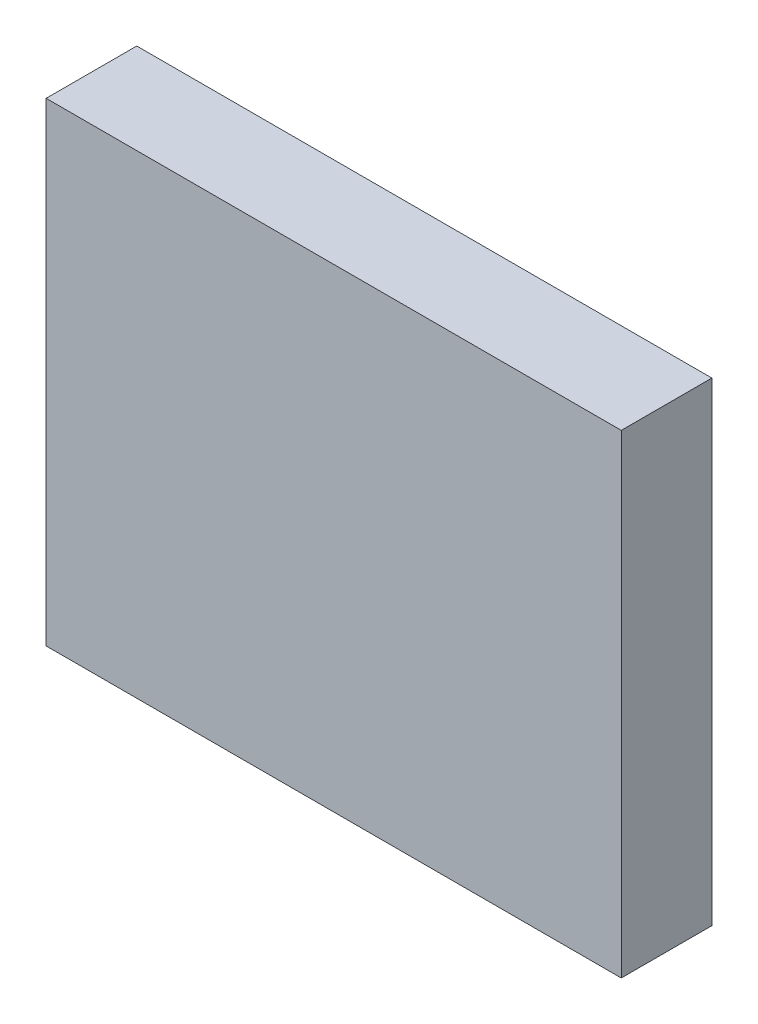
ISO-10303-21;
HEADER;
FILE_DESCRIPTION(('STEP AP214'),'2;1');
FILE_NAME('part.step','',(''),(''),'','','');
FILE_SCHEMA(('AUTOMOTIVE_DESIGN { 1 0 10303 214 1 1 1 1 }'));
ENDSEC;
DATA;
#1=APPLICATION_CONTEXT('core data for automotive mechanical design processes');
#2=APPLICATION_PROTOCOL_DEFINITION('international standard','automotive_design',2000,#1);
#3=PRODUCT_CONTEXT('',#1,'mechanical');
#4=PRODUCT('Part','Part','',(#3));
#5=PRODUCT_RELATED_PRODUCT_CATEGORY('part','',(#4));
#6=PRODUCT_DEFINITION_FORMATION('','',#4);
#7=PRODUCT_DEFINITION_CONTEXT('part definition',#1,'design');
#8=PRODUCT_DEFINITION('design','',#6,#7);
#9=PRODUCT_DEFINITION_SHAPE('','',#8);
#10=(LENGTH_UNIT() NAMED_UNIT(*) SI_UNIT(.MILLI.,.METRE.));
#11=(NAMED_UNIT(*) PLANE_ANGLE_UNIT() SI_UNIT($,.RADIAN.));
#12=(NAMED_UNIT(*) SI_UNIT($,.STERADIAN.) SOLID_ANGLE_UNIT());
#13=UNCERTAINTY_MEASURE_WITH_UNIT(LENGTH_MEASURE(1.E-05),#10,'distance_accuracy_value','');
#14=(GEOMETRIC_REPRESENTATION_CONTEXT(3) GLOBAL_UNCERTAINTY_ASSIGNED_CONTEXT((#13)) GLOBAL_UNIT_ASSIGNED_CONTEXT((#10,
#11,#12)) REPRESENTATION_CONTEXT('',''));
#15=CARTESIAN_POINT('',(0.,0.,0.));
#16=DIRECTION('',(0.,0.,1.));
#17=DIRECTION('',(1.,0.,0.));
#18=AXIS2_PLACEMENT_3D('',#15,#16,#17);
#19=CARTESIAN_POINT('',(0.,13.,0.));
#20=DIRECTION('',(-1.,0.,0.));
#21=DIRECTION('',(0.,0.,1.));
#22=AXIS2_PLACEMENT_3D('',#19,#20,#21);
#23=PLANE('',#22);
#24=DIRECTION('',(0.,0.,-1.));
#25=VECTOR('',#24,1.);
#26=CARTESIAN_POINT('',(0.,0.,0.));
#27=LINE('',#26,#25);
#28=CARTESIAN_POINT('',(0.,0.,0.));
#29=VERTEX_POINT('',#28);
#30=CARTESIAN_POINT('',(0.,0.,-2.48338256939239));
#31=VERTEX_POINT('',#30);
#32=EDGE_CURVE('E96',#29,#31,#27,.T.);
#33=ORIENTED_EDGE('',*,*,#32,.T.);
#34=DIRECTION('',(0.,-1.,0.));
#35=VECTOR('',#34,1.);
#36=CARTESIAN_POINT('',(0.,13.,-2.48338256939239));
#37=LINE('',#36,#35);
#38=CARTESIAN_POINT('',(0.,13.,-2.48338256939239));
#39=VERTEX_POINT('',#38);
#40=EDGE_CURVE('E11',#39,#31,#37,.T.);
#41=ORIENTED_EDGE('',*,*,#40,.F.);
#42=DIRECTION('',(0.,0.,-1.));
#43=VECTOR('',#42,1.);
#44=CARTESIAN_POINT('',(0.,13.,0.));
#45=LINE('',#44,#43);
#46=CARTESIAN_POINT('',(0.,13.,0.));
#47=VERTEX_POINT('',#46);
#48=EDGE_CURVE('E84',#47,#39,#45,.T.);
#49=ORIENTED_EDGE('',*,*,#48,.F.);
#50=DIRECTION('',(0.,-1.,0.));
#51=VECTOR('',#50,1.);
#52=CARTESIAN_POINT('',(0.,13.,0.));
#53=LINE('',#52,#51);
#54=EDGE_CURVE('E92',#47,#29,#53,.T.);
#55=ORIENTED_EDGE('',*,*,#54,.T.);
#56=EDGE_LOOP('',(#33,#41,#49,#55));
#57=FACE_BOUND('',#56,.T.);
#58=ADVANCED_FACE('F33',(#57),#23,.F.);
#59=CARTESIAN_POINT('',(0.,13.,-2.48338256939239));
#60=DIRECTION('',(0.,0.,1.));
#61=DIRECTION('',(1.,0.,0.));
#62=AXIS2_PLACEMENT_3D('',#59,#60,#61);
#63=PLANE('',#62);
#64=DIRECTION('',(-1.,0.,0.));
#65=VECTOR('',#64,1.);
#66=CARTESIAN_POINT('',(0.,0.,-2.48338256939239));
#67=LINE('',#66,#65);
#68=CARTESIAN_POINT('',(-15.7640806578822,0.,-2.48338256939239));
#69=VERTEX_POINT('',#68);
#70=EDGE_CURVE('E88',#31,#69,#67,.T.);
#71=ORIENTED_EDGE('',*,*,#70,.T.);
#72=DIRECTION('',(0.,-1.,0.));
#73=VECTOR('',#72,1.);
#74=CARTESIAN_POINT('',(-15.7640806578822,13.,-2.48338256939239));
#75=LINE('',#74,#73);
#76=CARTESIAN_POINT('',(-15.7640806578822,13.,-2.48338256939239));
#77=VERTEX_POINT('',#76);
#78=EDGE_CURVE('E41',#77,#69,#75,.T.);
#79=ORIENTED_EDGE('',*,*,#78,.F.);
#80=DIRECTION('',(-1.,0.,0.));
#81=VECTOR('',#80,1.);
#82=CARTESIAN_POINT('',(0.,13.,-2.48338256939239));
#83=LINE('',#82,#81);
#84=EDGE_CURVE('E79',#39,#77,#83,.T.);
#85=ORIENTED_EDGE('',*,*,#84,.F.);
#86=ORIENTED_EDGE('',*,*,#40,.T.);
#87=EDGE_LOOP('',(#71,#79,#85,#86));
#88=FACE_BOUND('',#87,.T.);
#89=ADVANCED_FACE('F87',(#88),#63,.F.);
#90=CARTESIAN_POINT('',(-15.7640806578822,13.,0.));
#91=DIRECTION('',(1.,0.,0.));
#92=DIRECTION('',(0.,0.,-1.));
#93=AXIS2_PLACEMENT_3D('',#90,#91,#92);
#94=PLANE('',#93);
#95=DIRECTION('',(0.,0.,1.));
#96=VECTOR('',#95,1.);
#97=CARTESIAN_POINT('',(-15.7640806578822,0.,0.));
#98=LINE('',#97,#96);
#99=CARTESIAN_POINT('',(-15.7640806578822,0.,0.));
#100=VERTEX_POINT('',#99);
#101=EDGE_CURVE('E66',#69,#100,#98,.T.);
#102=ORIENTED_EDGE('',*,*,#101,.T.);
#103=DIRECTION('',(0.,-1.,0.));
#104=VECTOR('',#103,1.);
#105=CARTESIAN_POINT('',(-15.7640806578822,13.,0.));
#106=LINE('',#105,#104);
#107=CARTESIAN_POINT('',(-15.7640806578822,13.,0.));
#108=VERTEX_POINT('',#107);
#109=EDGE_CURVE('E89',#108,#100,#106,.T.);
#110=ORIENTED_EDGE('',*,*,#109,.F.);
#111=DIRECTION('',(0.,0.,1.));
#112=VECTOR('',#111,1.);
#113=CARTESIAN_POINT('',(-15.7640806578822,13.,0.));
#114=LINE('',#113,#112);
#115=EDGE_CURVE('E82',#77,#108,#114,.T.);
#116=ORIENTED_EDGE('',*,*,#115,.F.);
#117=ORIENTED_EDGE('',*,*,#78,.T.);
#118=EDGE_LOOP('',(#102,#110,#116,#117));
#119=FACE_BOUND('',#118,.T.);
#120=ADVANCED_FACE('F90',(#119),#94,.F.);
#121=CARTESIAN_POINT('',(0.,13.,0.));
#122=DIRECTION('',(0.,0.,-1.));
#123=DIRECTION('',(-1.,0.,0.));
#124=AXIS2_PLACEMENT_3D('',#121,#122,#123);
#125=PLANE('',#124);
#126=DIRECTION('',(1.,0.,0.));
#127=VECTOR('',#126,1.);
#128=CARTESIAN_POINT('',(0.,0.,0.));
#129=LINE('',#128,#127);
#130=EDGE_CURVE('E72',#100,#29,#129,.T.);
#131=ORIENTED_EDGE('',*,*,#130,.T.);
#132=ORIENTED_EDGE('',*,*,#54,.F.);
#133=DIRECTION('',(1.,0.,0.));
#134=VECTOR('',#133,1.);
#135=CARTESIAN_POINT('',(0.,13.,0.));
#136=LINE('',#135,#134);
#137=EDGE_CURVE('E49',#108,#47,#136,.T.);
#138=ORIENTED_EDGE('',*,*,#137,.F.);
#139=ORIENTED_EDGE('',*,*,#109,.T.);
#140=EDGE_LOOP('',(#131,#132,#138,#139));
#141=FACE_BOUND('',#140,.T.);
#142=ADVANCED_FACE('F103',(#141),#125,.F.);
#143=CARTESIAN_POINT('',(0.,13.,0.));
#144=DIRECTION('',(0.,1.,0.));
#145=DIRECTION('',(0.,0.,1.));
#146=AXIS2_PLACEMENT_3D('',#143,#144,#145);
#147=PLANE('',#146);
#148=ORIENTED_EDGE('',*,*,#48,.T.);
#149=ORIENTED_EDGE('',*,*,#84,.T.);
#150=ORIENTED_EDGE('',*,*,#115,.T.);
#151=ORIENTED_EDGE('',*,*,#137,.T.);
#152=EDGE_LOOP('',(#148,#149,#150,#151));
#153=FACE_BOUND('',#152,.T.);
#154=ADVANCED_FACE('F80',(#153),#147,.T.);
#155=CARTESIAN_POINT('',(0.,0.,0.));
#156=DIRECTION('',(0.,1.,0.));
#157=DIRECTION('',(0.,0.,1.));
#158=AXIS2_PLACEMENT_3D('',#155,#156,#157);
#159=PLANE('',#158);
#160=ORIENTED_EDGE('',*,*,#32,.F.);
#161=ORIENTED_EDGE('',*,*,#130,.F.);
#162=ORIENTED_EDGE('',*,*,#101,.F.);
#163=ORIENTED_EDGE('',*,*,#70,.F.);
#164=EDGE_LOOP('',(#160,#161,#162,#163));
#165=FACE_BOUND('',#164,.T.);
#166=ADVANCED_FACE('F106',(#165),#159,.F.);
#167=CLOSED_SHELL('',(#58,#89,#120,#142,#154,#166));
#168=MANIFOLD_SOLID_BREP('B2',#167);
#169=ADVANCED_BREP_SHAPE_REPRESENTATION('',(#18,#168),#14);
#170=SHAPE_DEFINITION_REPRESENTATION(#9,#169);
ENDSEC;
END-ISO-10303-21;
